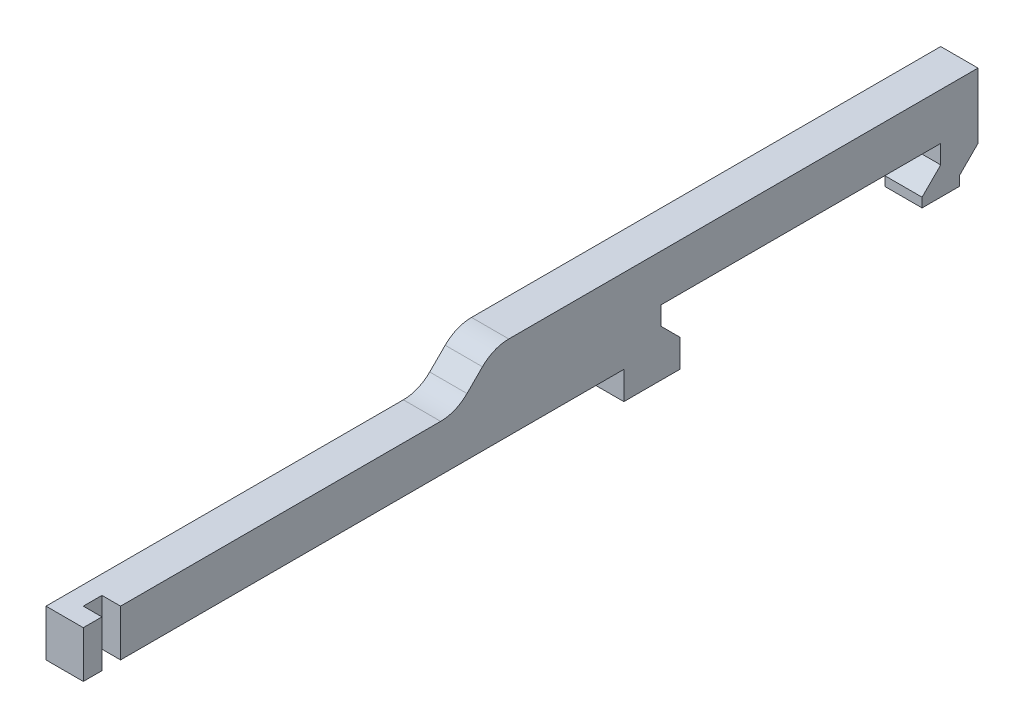
ISO-10303-21;
HEADER;
FILE_DESCRIPTION(('STEP AP214'),'2;1');
FILE_NAME('part.step','',(''),(''),'','','');
FILE_SCHEMA(('AUTOMOTIVE_DESIGN { 1 0 10303 214 1 1 1 1 }'));
ENDSEC;
DATA;
#1=APPLICATION_CONTEXT('core data for automotive mechanical design processes');
#2=APPLICATION_PROTOCOL_DEFINITION('international standard','automotive_design',2000,#1);
#3=PRODUCT_CONTEXT('',#1,'mechanical');
#4=PRODUCT('Part','Part','',(#3));
#5=PRODUCT_RELATED_PRODUCT_CATEGORY('part','',(#4));
#6=PRODUCT_DEFINITION_FORMATION('','',#4);
#7=PRODUCT_DEFINITION_CONTEXT('part definition',#1,'design');
#8=PRODUCT_DEFINITION('design','',#6,#7);
#9=PRODUCT_DEFINITION_SHAPE('','',#8);
#10=(LENGTH_UNIT() NAMED_UNIT(*) SI_UNIT(.MILLI.,.METRE.));
#11=(NAMED_UNIT(*) PLANE_ANGLE_UNIT() SI_UNIT($,.RADIAN.));
#12=(NAMED_UNIT(*) SI_UNIT($,.STERADIAN.) SOLID_ANGLE_UNIT());
#13=UNCERTAINTY_MEASURE_WITH_UNIT(LENGTH_MEASURE(1.E-05),#10,'distance_accuracy_value','');
#14=(GEOMETRIC_REPRESENTATION_CONTEXT(3) GLOBAL_UNCERTAINTY_ASSIGNED_CONTEXT((#13)) GLOBAL_UNIT_ASSIGNED_CONTEXT((#10,
#11,#12)) REPRESENTATION_CONTEXT('',''));
#15=CARTESIAN_POINT('',(0.,0.,0.));
#16=DIRECTION('',(0.,0.,1.));
#17=DIRECTION('',(1.,0.,0.));
#18=AXIS2_PLACEMENT_3D('',#15,#16,#17);
#19=CARTESIAN_POINT('',(2.,0.,0.));
#20=DIRECTION('',(1.,0.,0.));
#21=DIRECTION('',(0.,0.,-1.));
#22=AXIS2_PLACEMENT_3D('',#19,#20,#21);
#23=PLANE('',#22);
#24=DIRECTION('',(0.,-1.,0.));
#25=VECTOR('',#24,1.);
#26=CARTESIAN_POINT('',(2.,0.,-1.));
#27=LINE('',#26,#25);
#28=CARTESIAN_POINT('',(2.,2.5,-1.));
#29=VERTEX_POINT('',#28);
#30=CARTESIAN_POINT('',(2.,0.,-1.));
#31=VERTEX_POINT('',#30);
#32=EDGE_CURVE('E45',#29,#31,#27,.T.);
#33=ORIENTED_EDGE('',*,*,#32,.F.);
#34=DIRECTION('',(0.,0.,-1.));
#35=VECTOR('',#34,1.);
#36=CARTESIAN_POINT('',(2.,2.5,0.));
#37=LINE('',#36,#35);
#38=CARTESIAN_POINT('',(2.,2.5,0.));
#39=VERTEX_POINT('',#38);
#40=EDGE_CURVE('E216',#39,#29,#37,.T.);
#41=ORIENTED_EDGE('',*,*,#40,.F.);
#42=DIRECTION('',(0.,1.,0.));
#43=VECTOR('',#42,1.);
#44=CARTESIAN_POINT('',(2.,0.,0.));
#45=LINE('',#44,#43);
#46=CARTESIAN_POINT('',(2.,0.,0.));
#47=VERTEX_POINT('',#46);
#48=EDGE_CURVE('E220',#47,#39,#45,.T.);
#49=ORIENTED_EDGE('',*,*,#48,.F.);
#50=DIRECTION('',(0.,0.,-1.));
#51=VECTOR('',#50,1.);
#52=CARTESIAN_POINT('',(2.,0.,0.));
#53=LINE('',#52,#51);
#54=EDGE_CURVE('E229',#47,#31,#53,.T.);
#55=ORIENTED_EDGE('',*,*,#54,.T.);
#56=EDGE_LOOP('',(#33,#41,#49,#55));
#57=FACE_BOUND('',#56,.T.);
#58=ADVANCED_FACE('F37',(#57),#23,.T.);
#59=CARTESIAN_POINT('',(2.,0.,-48.));
#60=DIRECTION('',(0.,0.,1.));
#61=DIRECTION('',(1.,0.,0.));
#62=AXIS2_PLACEMENT_3D('',#59,#60,#61);
#63=PLANE('',#62);
#64=DIRECTION('',(0.,1.,0.));
#65=VECTOR('',#64,1.);
#66=CARTESIAN_POINT('',(0.,0.,-48.));
#67=LINE('',#66,#65);
#68=CARTESIAN_POINT('',(0.,1.,-48.));
#69=VERTEX_POINT('',#68);
#70=CARTESIAN_POINT('',(0.,4.5,-48.));
#71=VERTEX_POINT('',#70);
#72=EDGE_CURVE('E259',#69,#71,#67,.T.);
#73=ORIENTED_EDGE('',*,*,#72,.T.);
#74=DIRECTION('',(-1.,0.,0.));
#75=VECTOR('',#74,1.);
#76=CARTESIAN_POINT('',(2.,4.5,-48.));
#77=LINE('',#76,#75);
#78=CARTESIAN_POINT('',(2.,4.5,-48.));
#79=VERTEX_POINT('',#78);
#80=EDGE_CURVE('E344',#79,#71,#77,.T.);
#81=ORIENTED_EDGE('',*,*,#80,.F.);
#82=DIRECTION('',(0.,1.,0.));
#83=VECTOR('',#82,1.);
#84=CARTESIAN_POINT('',(2.,0.,-48.));
#85=LINE('',#84,#83);
#86=CARTESIAN_POINT('',(2.,1.,-48.));
#87=VERTEX_POINT('',#86);
#88=EDGE_CURVE('E304',#87,#79,#85,.T.);
#89=ORIENTED_EDGE('',*,*,#88,.F.);
#90=DIRECTION('',(-1.,0.,0.));
#91=VECTOR('',#90,1.);
#92=CARTESIAN_POINT('',(2.,1.,-48.));
#93=LINE('',#92,#91);
#94=EDGE_CURVE('E258',#87,#69,#93,.T.);
#95=ORIENTED_EDGE('',*,*,#94,.T.);
#96=EDGE_LOOP('',(#73,#81,#89,#95));
#97=FACE_BOUND('',#96,.T.);
#98=ADVANCED_FACE('F431',(#97),#63,.F.);
#99=CARTESIAN_POINT('',(2.,4.49999999999999,0.));
#100=DIRECTION('',(0.,-1.,0.));
#101=DIRECTION('',(0.,0.,-1.));
#102=AXIS2_PLACEMENT_3D('',#99,#100,#101);
#103=PLANE('',#102);
#104=DIRECTION('',(0.,0.,1.));
#105=VECTOR('',#104,1.);
#106=CARTESIAN_POINT('',(0.,4.49999999999999,0.));
#107=LINE('',#106,#105);
#108=CARTESIAN_POINT('',(0.,4.5,-22.8284271247462));
#109=VERTEX_POINT('',#108);
#110=EDGE_CURVE('E262',#71,#109,#107,.T.);
#111=ORIENTED_EDGE('',*,*,#110,.T.);
#112=DIRECTION('',(-1.,0.,0.));
#113=VECTOR('',#112,1.);
#114=CARTESIAN_POINT('',(2.,4.5,-22.8284271247462));
#115=LINE('',#114,#113);
#116=CARTESIAN_POINT('',(2.,4.5,-22.8284271247462));
#117=VERTEX_POINT('',#116);
#118=EDGE_CURVE('E354',#109,#117,#115,.F.);
#119=ORIENTED_EDGE('',*,*,#118,.T.);
#120=DIRECTION('',(0.,0.,1.));
#121=VECTOR('',#120,1.);
#122=CARTESIAN_POINT('',(2.,4.49999999999999,0.));
#123=LINE('',#122,#121);
#124=EDGE_CURVE('E222',#79,#117,#123,.T.);
#125=ORIENTED_EDGE('',*,*,#124,.F.);
#126=ORIENTED_EDGE('',*,*,#80,.T.);
#127=EDGE_LOOP('',(#111,#119,#125,#126));
#128=FACE_BOUND('',#127,.T.);
#129=ADVANCED_FACE('F438',(#128),#103,.F.);
#130=CARTESIAN_POINT('',(2.,-8.75,-8.75000000000001));
#131=DIRECTION('',(0.,0.707106781186547,0.707106781186548));
#132=DIRECTION('',(0.,-0.707106781186548,0.707106781186547));
#133=AXIS2_PLACEMENT_3D('',#130,#131,#132);
#134=PLANE('',#133);
#135=DIRECTION('',(0.,0.707106781186548,-0.707106781186547));
#136=VECTOR('',#135,1.);
#137=CARTESIAN_POINT('',(2.,-8.75,-8.75000000000001));
#138=LINE('',#137,#136);
#139=CARTESIAN_POINT('',(2.,3.08578643762691,-20.5857864376269));
#140=VERTEX_POINT('',#139);
#141=CARTESIAN_POINT('',(2.,3.91421356237309,-21.4142135623731));
#142=VERTEX_POINT('',#141);
#143=EDGE_CURVE('E217',#140,#142,#138,.T.);
#144=ORIENTED_EDGE('',*,*,#143,.T.);
#145=DIRECTION('',(-1.,0.,0.));
#146=VECTOR('',#145,1.);
#147=CARTESIAN_POINT('',(0.,3.91421356237309,-21.4142135623731));
#148=LINE('',#147,#146);
#149=CARTESIAN_POINT('',(0.,3.91421356237309,-21.4142135623731));
#150=VERTEX_POINT('',#149);
#151=EDGE_CURVE('E349',#142,#150,#148,.T.);
#152=ORIENTED_EDGE('',*,*,#151,.T.);
#153=DIRECTION('',(0.,0.707106781186548,-0.707106781186547));
#154=VECTOR('',#153,1.);
#155=CARTESIAN_POINT('',(0.,-8.75,-8.75000000000001));
#156=LINE('',#155,#154);
#157=CARTESIAN_POINT('',(0.,3.08578643762691,-20.5857864376269));
#158=VERTEX_POINT('',#157);
#159=EDGE_CURVE('E266',#158,#150,#156,.T.);
#160=ORIENTED_EDGE('',*,*,#159,.F.);
#161=DIRECTION('',(-1.,0.,0.));
#162=VECTOR('',#161,1.);
#163=CARTESIAN_POINT('',(2.,3.08578643762691,-20.5857864376269));
#164=LINE('',#163,#162);
#165=EDGE_CURVE('E347',#158,#140,#164,.F.);
#166=ORIENTED_EDGE('',*,*,#165,.T.);
#167=EDGE_LOOP('',(#144,#152,#160,#166));
#168=FACE_BOUND('',#167,.T.);
#169=ADVANCED_FACE('F414',(#168),#134,.T.);
#170=CARTESIAN_POINT('',(2.,2.5,0.));
#171=DIRECTION('',(0.,1.,0.));
#172=DIRECTION('',(0.,0.,1.));
#173=AXIS2_PLACEMENT_3D('',#170,#171,#172);
#174=PLANE('',#173);
#175=DIRECTION('',(1.,0.,0.));
#176=VECTOR('',#175,1.);
#177=CARTESIAN_POINT('',(2.,2.5,-1.));
#178=LINE('',#177,#176);
#179=CARTESIAN_POINT('',(1.,2.5,-1.));
#180=VERTEX_POINT('',#179);
#181=EDGE_CURVE('E367',#180,#29,#178,.T.);
#182=ORIENTED_EDGE('',*,*,#181,.F.);
#183=DIRECTION('',(0.,0.,1.));
#184=VECTOR('',#183,1.);
#185=CARTESIAN_POINT('',(1.,2.5,-1.));
#186=LINE('',#185,#184);
#187=CARTESIAN_POINT('',(1.,2.5,-2.));
#188=VERTEX_POINT('',#187);
#189=EDGE_CURVE('E210',#188,#180,#186,.T.);
#190=ORIENTED_EDGE('',*,*,#189,.F.);
#191=DIRECTION('',(-1.,0.,0.));
#192=VECTOR('',#191,1.);
#193=CARTESIAN_POINT('',(2.,2.5,-2.));
#194=LINE('',#193,#192);
#195=CARTESIAN_POINT('',(2.,2.5,-2.));
#196=VERTEX_POINT('',#195);
#197=EDGE_CURVE('E201',#196,#188,#194,.T.);
#198=ORIENTED_EDGE('',*,*,#197,.F.);
#199=CARTESIAN_POINT('',(2.,2.5,-19.1715728752538));
#200=VERTEX_POINT('',#199);
#201=EDGE_CURVE('E60',#196,#200,#37,.T.);
#202=ORIENTED_EDGE('',*,*,#201,.T.);
#203=DIRECTION('',(-1.,0.,0.));
#204=VECTOR('',#203,1.);
#205=CARTESIAN_POINT('',(0.,2.5,-19.1715728752538));
#206=LINE('',#205,#204);
#207=CARTESIAN_POINT('',(0.,2.5,-19.1715728752538));
#208=VERTEX_POINT('',#207);
#209=EDGE_CURVE('E358',#200,#208,#206,.T.);
#210=ORIENTED_EDGE('',*,*,#209,.T.);
#211=DIRECTION('',(0.,0.,-1.));
#212=VECTOR('',#211,1.);
#213=CARTESIAN_POINT('',(0.,2.5,0.));
#214=LINE('',#213,#212);
#215=CARTESIAN_POINT('',(0.,2.5,0.));
#216=VERTEX_POINT('',#215);
#217=EDGE_CURVE('E269',#216,#208,#214,.T.);
#218=ORIENTED_EDGE('',*,*,#217,.F.);
#219=DIRECTION('',(-1.,0.,0.));
#220=VECTOR('',#219,1.);
#221=CARTESIAN_POINT('',(2.,2.5,0.));
#222=LINE('',#221,#220);
#223=EDGE_CURVE('E342',#39,#216,#222,.T.);
#224=ORIENTED_EDGE('',*,*,#223,.F.);
#225=ORIENTED_EDGE('',*,*,#40,.T.);
#226=EDGE_LOOP('',(#182,#190,#198,#202,#210,#218,#224,#225));
#227=FACE_BOUND('',#226,.T.);
#228=ADVANCED_FACE('F208',(#227),#174,.T.);
#229=CARTESIAN_POINT('',(2.,0.,0.));
#230=DIRECTION('',(0.,0.,1.));
#231=DIRECTION('',(1.,0.,0.));
#232=AXIS2_PLACEMENT_3D('',#229,#230,#231);
#233=PLANE('',#232);
#234=DIRECTION('',(0.,1.,0.));
#235=VECTOR('',#234,1.);
#236=CARTESIAN_POINT('',(0.,0.,0.));
#237=LINE('',#236,#235);
#238=CARTESIAN_POINT('',(0.,0.,0.));
#239=VERTEX_POINT('',#238);
#240=EDGE_CURVE('E272',#239,#216,#237,.T.);
#241=ORIENTED_EDGE('',*,*,#240,.F.);
#242=DIRECTION('',(-1.,0.,0.));
#243=VECTOR('',#242,1.);
#244=CARTESIAN_POINT('',(2.,0.,0.));
#245=LINE('',#244,#243);
#246=EDGE_CURVE('E340',#47,#239,#245,.T.);
#247=ORIENTED_EDGE('',*,*,#246,.F.);
#248=ORIENTED_EDGE('',*,*,#48,.T.);
#249=ORIENTED_EDGE('',*,*,#223,.T.);
#250=EDGE_LOOP('',(#241,#247,#248,#249));
#251=FACE_BOUND('',#250,.T.);
#252=ADVANCED_FACE('F377',(#251),#233,.T.);
#253=CARTESIAN_POINT('',(2.,0.,0.));
#254=DIRECTION('',(0.,1.,0.));
#255=DIRECTION('',(0.,0.,1.));
#256=AXIS2_PLACEMENT_3D('',#253,#254,#255);
#257=PLANE('',#256);
#258=DIRECTION('',(0.,0.,1.));
#259=VECTOR('',#258,1.);
#260=CARTESIAN_POINT('',(1.,0.,0.));
#261=LINE('',#260,#259);
#262=CARTESIAN_POINT('',(1.,0.,-2.));
#263=VERTEX_POINT('',#262);
#264=CARTESIAN_POINT('',(1.,0.,-1.));
#265=VERTEX_POINT('',#264);
#266=EDGE_CURVE('E11',#263,#265,#261,.T.);
#267=ORIENTED_EDGE('',*,*,#266,.T.);
#268=DIRECTION('',(1.,0.,0.));
#269=VECTOR('',#268,1.);
#270=CARTESIAN_POINT('',(2.,0.,-1.));
#271=LINE('',#270,#269);
#272=EDGE_CURVE('E263',#265,#31,#271,.T.);
#273=ORIENTED_EDGE('',*,*,#272,.T.);
#274=ORIENTED_EDGE('',*,*,#54,.F.);
#275=ORIENTED_EDGE('',*,*,#246,.T.);
#276=DIRECTION('',(0.,0.,-1.));
#277=VECTOR('',#276,1.);
#278=CARTESIAN_POINT('',(0.,0.,0.));
#279=LINE('',#278,#277);
#280=CARTESIAN_POINT('',(0.,0.,-29.));
#281=VERTEX_POINT('',#280);
#282=EDGE_CURVE('E275',#239,#281,#279,.T.);
#283=ORIENTED_EDGE('',*,*,#282,.T.);
#284=DIRECTION('',(-1.,0.,0.));
#285=VECTOR('',#284,1.);
#286=CARTESIAN_POINT('',(2.,0.,-29.));
#287=LINE('',#286,#285);
#288=CARTESIAN_POINT('',(2.,0.,-29.));
#289=VERTEX_POINT('',#288);
#290=EDGE_CURVE('E337',#289,#281,#287,.T.);
#291=ORIENTED_EDGE('',*,*,#290,.F.);
#292=CARTESIAN_POINT('',(2.,0.,-2.));
#293=VERTEX_POINT('',#292);
#294=EDGE_CURVE('E228',#293,#289,#53,.T.);
#295=ORIENTED_EDGE('',*,*,#294,.F.);
#296=DIRECTION('',(-1.,0.,0.));
#297=VECTOR('',#296,1.);
#298=CARTESIAN_POINT('',(2.,0.,-2.));
#299=LINE('',#298,#297);
#300=EDGE_CURVE('E52',#293,#263,#299,.T.);
#301=ORIENTED_EDGE('',*,*,#300,.T.);
#302=EDGE_LOOP('',(#267,#273,#274,#275,#283,#291,#295,#301));
#303=FACE_BOUND('',#302,.T.);
#304=ADVANCED_FACE('F372',(#303),#257,.F.);
#305=CARTESIAN_POINT('',(2.,0.,-29.));
#306=DIRECTION('',(0.,0.,-1.));
#307=DIRECTION('',(-1.,0.,0.));
#308=AXIS2_PLACEMENT_3D('',#305,#306,#307);
#309=PLANE('',#308);
#310=DIRECTION('',(0.,-1.,0.));
#311=VECTOR('',#310,1.);
#312=CARTESIAN_POINT('',(0.,0.,-29.));
#313=LINE('',#312,#311);
#314=CARTESIAN_POINT('',(0.,-1.5,-29.));
#315=VERTEX_POINT('',#314);
#316=EDGE_CURVE('E277',#281,#315,#313,.T.);
#317=ORIENTED_EDGE('',*,*,#316,.T.);
#318=DIRECTION('',(-1.,0.,0.));
#319=VECTOR('',#318,1.);
#320=CARTESIAN_POINT('',(2.,-1.5,-29.));
#321=LINE('',#320,#319);
#322=CARTESIAN_POINT('',(2.,-1.5,-29.));
#323=VERTEX_POINT('',#322);
#324=EDGE_CURVE('E334',#323,#315,#321,.T.);
#325=ORIENTED_EDGE('',*,*,#324,.F.);
#326=DIRECTION('',(0.,-1.,0.));
#327=VECTOR('',#326,1.);
#328=CARTESIAN_POINT('',(2.,0.,-29.));
#329=LINE('',#328,#327);
#330=EDGE_CURVE('E232',#289,#323,#329,.T.);
#331=ORIENTED_EDGE('',*,*,#330,.F.);
#332=ORIENTED_EDGE('',*,*,#290,.T.);
#333=EDGE_LOOP('',(#317,#325,#331,#332));
#334=FACE_BOUND('',#333,.T.);
#335=ADVANCED_FACE('F388',(#334),#309,.F.);
#336=CARTESIAN_POINT('',(2.,-1.5,0.));
#337=DIRECTION('',(0.,1.,0.));
#338=DIRECTION('',(0.,0.,1.));
#339=AXIS2_PLACEMENT_3D('',#336,#337,#338);
#340=PLANE('',#339);
#341=DIRECTION('',(0.,0.,-1.));
#342=VECTOR('',#341,1.);
#343=CARTESIAN_POINT('',(0.,-1.5,0.));
#344=LINE('',#343,#342);
#345=CARTESIAN_POINT('',(0.,-1.5,-32.));
#346=VERTEX_POINT('',#345);
#347=EDGE_CURVE('E279',#315,#346,#344,.T.);
#348=ORIENTED_EDGE('',*,*,#347,.T.);
#349=DIRECTION('',(-1.,0.,0.));
#350=VECTOR('',#349,1.);
#351=CARTESIAN_POINT('',(2.,-1.5,-32.));
#352=LINE('',#351,#350);
#353=CARTESIAN_POINT('',(2.,-1.5,-32.));
#354=VERTEX_POINT('',#353);
#355=EDGE_CURVE('E331',#354,#346,#352,.T.);
#356=ORIENTED_EDGE('',*,*,#355,.F.);
#357=DIRECTION('',(0.,0.,-1.));
#358=VECTOR('',#357,1.);
#359=CARTESIAN_POINT('',(2.,-1.5,0.));
#360=LINE('',#359,#358);
#361=EDGE_CURVE('E234',#323,#354,#360,.T.);
#362=ORIENTED_EDGE('',*,*,#361,.F.);
#363=ORIENTED_EDGE('',*,*,#324,.T.);
#364=EDGE_LOOP('',(#348,#356,#362,#363));
#365=FACE_BOUND('',#364,.T.);
#366=ADVANCED_FACE('F392',(#365),#340,.F.);
#367=CARTESIAN_POINT('',(2.,0.,-32.));
#368=DIRECTION('',(0.,0.,1.));
#369=DIRECTION('',(1.,0.,0.));
#370=AXIS2_PLACEMENT_3D('',#367,#368,#369);
#371=PLANE('',#370);
#372=DIRECTION('',(0.,1.,0.));
#373=VECTOR('',#372,1.);
#374=CARTESIAN_POINT('',(0.,0.,-32.));
#375=LINE('',#374,#373);
#376=CARTESIAN_POINT('',(0.,0.,-32.));
#377=VERTEX_POINT('',#376);
#378=EDGE_CURVE('E281',#346,#377,#375,.T.);
#379=ORIENTED_EDGE('',*,*,#378,.T.);
#380=DIRECTION('',(-1.,0.,0.));
#381=VECTOR('',#380,1.);
#382=CARTESIAN_POINT('',(2.,0.,-32.));
#383=LINE('',#382,#381);
#384=CARTESIAN_POINT('',(2.,0.,-32.));
#385=VERTEX_POINT('',#384);
#386=EDGE_CURVE('E328',#385,#377,#383,.T.);
#387=ORIENTED_EDGE('',*,*,#386,.F.);
#388=DIRECTION('',(0.,1.,0.));
#389=VECTOR('',#388,1.);
#390=CARTESIAN_POINT('',(2.,0.,-32.));
#391=LINE('',#390,#389);
#392=EDGE_CURVE('E236',#354,#385,#391,.T.);
#393=ORIENTED_EDGE('',*,*,#392,.F.);
#394=ORIENTED_EDGE('',*,*,#355,.T.);
#395=EDGE_LOOP('',(#379,#387,#393,#394));
#396=FACE_BOUND('',#395,.T.);
#397=ADVANCED_FACE('F485',(#396),#371,.F.);
#398=CARTESIAN_POINT('',(2.,16.,-16.));
#399=DIRECTION('',(0.,-0.707106781186547,0.707106781186547));
#400=DIRECTION('',(0.,-0.707106781186548,-0.707106781186548));
#401=AXIS2_PLACEMENT_3D('',#398,#399,#400);
#402=PLANE('',#401);
#403=DIRECTION('',(0.,0.707106781186548,0.707106781186548));
#404=VECTOR('',#403,1.);
#405=CARTESIAN_POINT('',(0.,16.,-16.));
#406=LINE('',#405,#404);
#407=CARTESIAN_POINT('',(0.,1.,-31.));
#408=VERTEX_POINT('',#407);
#409=EDGE_CURVE('E283',#377,#408,#406,.T.);
#410=ORIENTED_EDGE('',*,*,#409,.T.);
#411=DIRECTION('',(-1.,0.,0.));
#412=VECTOR('',#411,1.);
#413=CARTESIAN_POINT('',(2.,1.,-31.));
#414=LINE('',#413,#412);
#415=CARTESIAN_POINT('',(2.,1.,-31.));
#416=VERTEX_POINT('',#415);
#417=EDGE_CURVE('E325',#416,#408,#414,.T.);
#418=ORIENTED_EDGE('',*,*,#417,.F.);
#419=DIRECTION('',(0.,0.707106781186548,0.707106781186548));
#420=VECTOR('',#419,1.);
#421=CARTESIAN_POINT('',(2.,16.,-16.));
#422=LINE('',#421,#420);
#423=EDGE_CURVE('E238',#385,#416,#422,.T.);
#424=ORIENTED_EDGE('',*,*,#423,.F.);
#425=ORIENTED_EDGE('',*,*,#386,.T.);
#426=EDGE_LOOP('',(#410,#418,#424,#425));
#427=FACE_BOUND('',#426,.T.);
#428=ADVANCED_FACE('F481',(#427),#402,.F.);
#429=CARTESIAN_POINT('',(2.,0.,-31.));
#430=DIRECTION('',(0.,0.,1.));
#431=DIRECTION('',(1.,0.,0.));
#432=AXIS2_PLACEMENT_3D('',#429,#430,#431);
#433=PLANE('',#432);
#434=DIRECTION('',(0.,1.,0.));
#435=VECTOR('',#434,1.);
#436=CARTESIAN_POINT('',(0.,0.,-31.));
#437=LINE('',#436,#435);
#438=CARTESIAN_POINT('',(0.,2.,-31.));
#439=VERTEX_POINT('',#438);
#440=EDGE_CURVE('E285',#408,#439,#437,.T.);
#441=ORIENTED_EDGE('',*,*,#440,.T.);
#442=DIRECTION('',(-1.,0.,0.));
#443=VECTOR('',#442,1.);
#444=CARTESIAN_POINT('',(2.,2.,-31.));
#445=LINE('',#444,#443);
#446=CARTESIAN_POINT('',(2.,2.,-31.));
#447=VERTEX_POINT('',#446);
#448=EDGE_CURVE('E322',#447,#439,#445,.T.);
#449=ORIENTED_EDGE('',*,*,#448,.F.);
#450=DIRECTION('',(0.,1.,0.));
#451=VECTOR('',#450,1.);
#452=CARTESIAN_POINT('',(2.,0.,-31.));
#453=LINE('',#452,#451);
#454=EDGE_CURVE('E240',#416,#447,#453,.T.);
#455=ORIENTED_EDGE('',*,*,#454,.F.);
#456=ORIENTED_EDGE('',*,*,#417,.T.);
#457=EDGE_LOOP('',(#441,#449,#455,#456));
#458=FACE_BOUND('',#457,.T.);
#459=ADVANCED_FACE('F477',(#458),#433,.F.);
#460=CARTESIAN_POINT('',(2.,2.,0.));
#461=DIRECTION('',(0.,1.,0.));
#462=DIRECTION('',(0.,0.,1.));
#463=AXIS2_PLACEMENT_3D('',#460,#461,#462);
#464=PLANE('',#463);
#465=DIRECTION('',(0.,0.,-1.));
#466=VECTOR('',#465,1.);
#467=CARTESIAN_POINT('',(0.,2.,0.));
#468=LINE('',#467,#466);
#469=CARTESIAN_POINT('',(0.,2.,-46.));
#470=VERTEX_POINT('',#469);
#471=EDGE_CURVE('E287',#439,#470,#468,.T.);
#472=ORIENTED_EDGE('',*,*,#471,.T.);
#473=DIRECTION('',(-1.,0.,0.));
#474=VECTOR('',#473,1.);
#475=CARTESIAN_POINT('',(2.,2.,-46.));
#476=LINE('',#475,#474);
#477=CARTESIAN_POINT('',(2.,2.,-46.));
#478=VERTEX_POINT('',#477);
#479=EDGE_CURVE('E320',#478,#470,#476,.T.);
#480=ORIENTED_EDGE('',*,*,#479,.F.);
#481=DIRECTION('',(0.,0.,-1.));
#482=VECTOR('',#481,1.);
#483=CARTESIAN_POINT('',(2.,2.,0.));
#484=LINE('',#483,#482);
#485=EDGE_CURVE('E242',#447,#478,#484,.T.);
#486=ORIENTED_EDGE('',*,*,#485,.F.);
#487=ORIENTED_EDGE('',*,*,#448,.T.);
#488=EDGE_LOOP('',(#472,#480,#486,#487));
#489=FACE_BOUND('',#488,.T.);
#490=ADVANCED_FACE('F473',(#489),#464,.F.);
#491=CARTESIAN_POINT('',(2.,0.,-46.));
#492=DIRECTION('',(0.,0.,1.));
#493=DIRECTION('',(1.,0.,0.));
#494=AXIS2_PLACEMENT_3D('',#491,#492,#493);
#495=PLANE('',#494);
#496=DIRECTION('',(0.,1.,0.));
#497=VECTOR('',#496,1.);
#498=CARTESIAN_POINT('',(0.,0.,-46.));
#499=LINE('',#498,#497);
#500=CARTESIAN_POINT('',(0.,1.,-46.));
#501=VERTEX_POINT('',#500);
#502=EDGE_CURVE('E290',#501,#470,#499,.T.);
#503=ORIENTED_EDGE('',*,*,#502,.F.);
#504=DIRECTION('',(-1.,0.,0.));
#505=VECTOR('',#504,1.);
#506=CARTESIAN_POINT('',(2.,1.,-46.));
#507=LINE('',#506,#505);
#508=CARTESIAN_POINT('',(2.,1.,-46.));
#509=VERTEX_POINT('',#508);
#510=EDGE_CURVE('E318',#509,#501,#507,.T.);
#511=ORIENTED_EDGE('',*,*,#510,.F.);
#512=DIRECTION('',(0.,1.,0.));
#513=VECTOR('',#512,1.);
#514=CARTESIAN_POINT('',(2.,0.,-46.));
#515=LINE('',#514,#513);
#516=EDGE_CURVE('E244',#509,#478,#515,.T.);
#517=ORIENTED_EDGE('',*,*,#516,.T.);
#518=ORIENTED_EDGE('',*,*,#479,.T.);
#519=EDGE_LOOP('',(#503,#511,#517,#518));
#520=FACE_BOUND('',#519,.T.);
#521=ADVANCED_FACE('F469',(#520),#495,.T.);
#522=CARTESIAN_POINT('',(2.,-22.5,-22.5));
#523=DIRECTION('',(0.,0.707106781186547,0.707106781186547));
#524=DIRECTION('',(0.,-0.707106781186548,0.707106781186548));
#525=AXIS2_PLACEMENT_3D('',#522,#523,#524);
#526=PLANE('',#525);
#527=DIRECTION('',(0.,0.707106781186548,-0.707106781186548));
#528=VECTOR('',#527,1.);
#529=CARTESIAN_POINT('',(0.,-22.5,-22.5));
#530=LINE('',#529,#528);
#531=CARTESIAN_POINT('',(0.,0.,-45.));
#532=VERTEX_POINT('',#531);
#533=EDGE_CURVE('E293',#532,#501,#530,.T.);
#534=ORIENTED_EDGE('',*,*,#533,.F.);
#535=DIRECTION('',(-1.,0.,0.));
#536=VECTOR('',#535,1.);
#537=CARTESIAN_POINT('',(2.,0.,-45.));
#538=LINE('',#537,#536);
#539=CARTESIAN_POINT('',(2.,0.,-45.));
#540=VERTEX_POINT('',#539);
#541=EDGE_CURVE('E316',#540,#532,#538,.T.);
#542=ORIENTED_EDGE('',*,*,#541,.F.);
#543=DIRECTION('',(0.,0.707106781186548,-0.707106781186548));
#544=VECTOR('',#543,1.);
#545=CARTESIAN_POINT('',(2.,-22.5,-22.5));
#546=LINE('',#545,#544);
#547=EDGE_CURVE('E247',#540,#509,#546,.T.);
#548=ORIENTED_EDGE('',*,*,#547,.T.);
#549=ORIENTED_EDGE('',*,*,#510,.T.);
#550=EDGE_LOOP('',(#534,#542,#548,#549));
#551=FACE_BOUND('',#550,.T.);
#552=ADVANCED_FACE('F465',(#551),#526,.T.);
#553=CARTESIAN_POINT('',(2.,0.,-45.));
#554=DIRECTION('',(0.,0.,-1.));
#555=DIRECTION('',(-1.,0.,0.));
#556=AXIS2_PLACEMENT_3D('',#553,#554,#555);
#557=PLANE('',#556);
#558=DIRECTION('',(0.,-1.,0.));
#559=VECTOR('',#558,1.);
#560=CARTESIAN_POINT('',(0.,0.,-45.));
#561=LINE('',#560,#559);
#562=CARTESIAN_POINT('',(0.,-0.499999999999998,-45.));
#563=VERTEX_POINT('',#562);
#564=EDGE_CURVE('E296',#532,#563,#561,.T.);
#565=ORIENTED_EDGE('',*,*,#564,.T.);
#566=DIRECTION('',(-1.,0.,0.));
#567=VECTOR('',#566,1.);
#568=CARTESIAN_POINT('',(2.,-0.499999999999998,-45.));
#569=LINE('',#568,#567);
#570=CARTESIAN_POINT('',(2.,-0.499999999999998,-45.));
#571=VERTEX_POINT('',#570);
#572=EDGE_CURVE('E313',#571,#563,#569,.T.);
#573=ORIENTED_EDGE('',*,*,#572,.F.);
#574=DIRECTION('',(0.,-1.,0.));
#575=VECTOR('',#574,1.);
#576=CARTESIAN_POINT('',(2.,0.,-45.));
#577=LINE('',#576,#575);
#578=EDGE_CURVE('E250',#540,#571,#577,.T.);
#579=ORIENTED_EDGE('',*,*,#578,.F.);
#580=ORIENTED_EDGE('',*,*,#541,.T.);
#581=EDGE_LOOP('',(#565,#573,#579,#580));
#582=FACE_BOUND('',#581,.T.);
#583=ADVANCED_FACE('F461',(#582),#557,.F.);
#584=CARTESIAN_POINT('',(2.,-0.499999999999998,0.));
#585=DIRECTION('',(0.,1.,0.));
#586=DIRECTION('',(0.,0.,1.));
#587=AXIS2_PLACEMENT_3D('',#584,#585,#586);
#588=PLANE('',#587);
#589=DIRECTION('',(0.,0.,-1.));
#590=VECTOR('',#589,1.);
#591=CARTESIAN_POINT('',(0.,-0.499999999999998,0.));
#592=LINE('',#591,#590);
#593=CARTESIAN_POINT('',(0.,-0.499999999999998,-47.));
#594=VERTEX_POINT('',#593);
#595=EDGE_CURVE('E298',#563,#594,#592,.T.);
#596=ORIENTED_EDGE('',*,*,#595,.T.);
#597=DIRECTION('',(-1.,0.,0.));
#598=VECTOR('',#597,1.);
#599=CARTESIAN_POINT('',(2.,-0.499999999999998,-47.));
#600=LINE('',#599,#598);
#601=CARTESIAN_POINT('',(2.,-0.499999999999998,-47.));
#602=VERTEX_POINT('',#601);
#603=EDGE_CURVE('E310',#602,#594,#600,.T.);
#604=ORIENTED_EDGE('',*,*,#603,.F.);
#605=DIRECTION('',(0.,0.,-1.));
#606=VECTOR('',#605,1.);
#607=CARTESIAN_POINT('',(2.,-0.499999999999998,0.));
#608=LINE('',#607,#606);
#609=EDGE_CURVE('E252',#571,#602,#608,.T.);
#610=ORIENTED_EDGE('',*,*,#609,.F.);
#611=ORIENTED_EDGE('',*,*,#572,.T.);
#612=EDGE_LOOP('',(#596,#604,#610,#611));
#613=FACE_BOUND('',#612,.T.);
#614=ADVANCED_FACE('F455',(#613),#588,.F.);
#615=CARTESIAN_POINT('',(2.,0.,-47.));
#616=DIRECTION('',(0.,0.,1.));
#617=DIRECTION('',(1.,0.,0.));
#618=AXIS2_PLACEMENT_3D('',#615,#616,#617);
#619=PLANE('',#618);
#620=DIRECTION('',(0.,1.,0.));
#621=VECTOR('',#620,1.);
#622=CARTESIAN_POINT('',(0.,0.,-47.));
#623=LINE('',#622,#621);
#624=CARTESIAN_POINT('',(0.,0.,-47.));
#625=VERTEX_POINT('',#624);
#626=EDGE_CURVE('E300',#594,#625,#623,.T.);
#627=ORIENTED_EDGE('',*,*,#626,.T.);
#628=DIRECTION('',(-1.,0.,0.));
#629=VECTOR('',#628,1.);
#630=CARTESIAN_POINT('',(2.,0.,-47.));
#631=LINE('',#630,#629);
#632=CARTESIAN_POINT('',(2.,0.,-47.));
#633=VERTEX_POINT('',#632);
#634=EDGE_CURVE('E307',#633,#625,#631,.T.);
#635=ORIENTED_EDGE('',*,*,#634,.F.);
#636=DIRECTION('',(0.,1.,0.));
#637=VECTOR('',#636,1.);
#638=CARTESIAN_POINT('',(2.,0.,-47.));
#639=LINE('',#638,#637);
#640=EDGE_CURVE('E254',#602,#633,#639,.T.);
#641=ORIENTED_EDGE('',*,*,#640,.F.);
#642=ORIENTED_EDGE('',*,*,#603,.T.);
#643=EDGE_LOOP('',(#627,#635,#641,#642));
#644=FACE_BOUND('',#643,.T.);
#645=ADVANCED_FACE('F449',(#644),#619,.F.);
#646=CARTESIAN_POINT('',(2.,-23.5,-23.5));
#647=DIRECTION('',(0.,0.707106781186547,0.707106781186548));
#648=DIRECTION('',(0.,-0.707106781186548,0.707106781186547));
#649=AXIS2_PLACEMENT_3D('',#646,#647,#648);
#650=PLANE('',#649);
#651=DIRECTION('',(0.,0.707106781186548,-0.707106781186547));
#652=VECTOR('',#651,1.);
#653=CARTESIAN_POINT('',(0.,-23.5,-23.5));
#654=LINE('',#653,#652);
#655=EDGE_CURVE('E302',#625,#69,#654,.T.);
#656=ORIENTED_EDGE('',*,*,#655,.T.);
#657=ORIENTED_EDGE('',*,*,#94,.F.);
#658=DIRECTION('',(0.,0.707106781186548,-0.707106781186547));
#659=VECTOR('',#658,1.);
#660=CARTESIAN_POINT('',(2.,-23.5,-23.5));
#661=LINE('',#660,#659);
#662=EDGE_CURVE('E256',#633,#87,#661,.T.);
#663=ORIENTED_EDGE('',*,*,#662,.F.);
#664=ORIENTED_EDGE('',*,*,#634,.T.);
#665=EDGE_LOOP('',(#656,#657,#663,#664));
#666=FACE_BOUND('',#665,.T.);
#667=ADVANCED_FACE('F443',(#666),#650,.F.);
#668=DIRECTION('',(0.,1.,0.));
#669=VECTOR('',#668,1.);
#670=CARTESIAN_POINT('',(2.,0.,-2.));
#671=LINE('',#670,#669);
#672=EDGE_CURVE('E199',#293,#196,#671,.T.);
#673=ORIENTED_EDGE('',*,*,#672,.F.);
#674=ORIENTED_EDGE('',*,*,#294,.T.);
#675=ORIENTED_EDGE('',*,*,#330,.T.);
#676=ORIENTED_EDGE('',*,*,#361,.T.);
#677=ORIENTED_EDGE('',*,*,#392,.T.);
#678=ORIENTED_EDGE('',*,*,#423,.T.);
#679=ORIENTED_EDGE('',*,*,#454,.T.);
#680=ORIENTED_EDGE('',*,*,#485,.T.);
#681=ORIENTED_EDGE('',*,*,#516,.F.);
#682=ORIENTED_EDGE('',*,*,#547,.F.);
#683=ORIENTED_EDGE('',*,*,#578,.T.);
#684=ORIENTED_EDGE('',*,*,#609,.T.);
#685=ORIENTED_EDGE('',*,*,#640,.T.);
#686=ORIENTED_EDGE('',*,*,#662,.T.);
#687=ORIENTED_EDGE('',*,*,#88,.T.);
#688=ORIENTED_EDGE('',*,*,#124,.T.);
#689=CARTESIAN_POINT('',(2.,2.5,-22.8284271247462));
#690=DIRECTION('',(1.,0.,0.));
#691=DIRECTION('',(0.,0.,-1.));
#692=AXIS2_PLACEMENT_3D('',#689,#690,#691);
#693=CIRCLE('',#692,2.);
#694=EDGE_CURVE('E356',#117,#142,#693,.T.);
#695=ORIENTED_EDGE('',*,*,#694,.T.);
#696=ORIENTED_EDGE('',*,*,#143,.F.);
#697=CARTESIAN_POINT('',(2.,4.5,-19.1715728752538));
#698=DIRECTION('',(1.,0.,0.));
#699=DIRECTION('',(0.,0.,-1.));
#700=AXIS2_PLACEMENT_3D('',#697,#698,#699);
#701=CIRCLE('',#700,2.);
#702=EDGE_CURVE('E205',#140,#200,#701,.F.);
#703=ORIENTED_EDGE('',*,*,#702,.T.);
#704=ORIENTED_EDGE('',*,*,#201,.F.);
#705=EDGE_LOOP('',(#673,#674,#675,#676,#677,#678,#679,#680,#681,#682,#683,#684,#685,#686,#687,
#688,#695,#696,#703,#704));
#706=FACE_BOUND('',#705,.T.);
#707=ADVANCED_FACE('F212',(#706),#23,.T.);
#708=CARTESIAN_POINT('',(0.,0.,0.));
#709=DIRECTION('',(1.,0.,0.));
#710=DIRECTION('',(0.,0.,-1.));
#711=AXIS2_PLACEMENT_3D('',#708,#709,#710);
#712=PLANE('',#711);
#713=ORIENTED_EDGE('',*,*,#159,.T.);
#714=CARTESIAN_POINT('',(0.,2.5,-22.8284271247462));
#715=DIRECTION('',(1.,0.,0.));
#716=DIRECTION('',(0.,0.,-1.));
#717=AXIS2_PLACEMENT_3D('',#714,#715,#716);
#718=CIRCLE('',#717,2.);
#719=EDGE_CURVE('E352',#150,#109,#718,.F.);
#720=ORIENTED_EDGE('',*,*,#719,.T.);
#721=ORIENTED_EDGE('',*,*,#110,.F.);
#722=ORIENTED_EDGE('',*,*,#72,.F.);
#723=ORIENTED_EDGE('',*,*,#655,.F.);
#724=ORIENTED_EDGE('',*,*,#626,.F.);
#725=ORIENTED_EDGE('',*,*,#595,.F.);
#726=ORIENTED_EDGE('',*,*,#564,.F.);
#727=ORIENTED_EDGE('',*,*,#533,.T.);
#728=ORIENTED_EDGE('',*,*,#502,.T.);
#729=ORIENTED_EDGE('',*,*,#471,.F.);
#730=ORIENTED_EDGE('',*,*,#440,.F.);
#731=ORIENTED_EDGE('',*,*,#409,.F.);
#732=ORIENTED_EDGE('',*,*,#378,.F.);
#733=ORIENTED_EDGE('',*,*,#347,.F.);
#734=ORIENTED_EDGE('',*,*,#316,.F.);
#735=ORIENTED_EDGE('',*,*,#282,.F.);
#736=ORIENTED_EDGE('',*,*,#240,.T.);
#737=ORIENTED_EDGE('',*,*,#217,.T.);
#738=CARTESIAN_POINT('',(0.,4.5,-19.1715728752538));
#739=DIRECTION('',(1.,0.,0.));
#740=DIRECTION('',(0.,0.,-1.));
#741=AXIS2_PLACEMENT_3D('',#738,#739,#740);
#742=CIRCLE('',#741,2.);
#743=EDGE_CURVE('E360',#208,#158,#742,.T.);
#744=ORIENTED_EDGE('',*,*,#743,.T.);
#745=EDGE_LOOP('',(#713,#720,#721,#722,#723,#724,#725,#726,#727,#728,#729,#730,#731,#732,#733,
#734,#735,#736,#737,#744));
#746=FACE_BOUND('',#745,.T.);
#747=ADVANCED_FACE('F383',(#746),#712,.F.);
#748=CARTESIAN_POINT('',(2.,2.5,-22.8284271247462));
#749=DIRECTION('',(1.,0.,0.));
#750=DIRECTION('',(0.,0.,-1.));
#751=AXIS2_PLACEMENT_3D('',#748,#749,#750);
#752=CYLINDRICAL_SURFACE('',#751,2.);
#753=ORIENTED_EDGE('',*,*,#694,.F.);
#754=ORIENTED_EDGE('',*,*,#118,.F.);
#755=ORIENTED_EDGE('',*,*,#719,.F.);
#756=ORIENTED_EDGE('',*,*,#151,.F.);
#757=EDGE_LOOP('',(#753,#754,#755,#756));
#758=FACE_BOUND('',#757,.T.);
#759=ADVANCED_FACE('F411',(#758),#752,.T.);
#760=CARTESIAN_POINT('',(2.,4.5,-19.1715728752538));
#761=DIRECTION('',(1.,0.,0.));
#762=DIRECTION('',(0.,0.,-1.));
#763=AXIS2_PLACEMENT_3D('',#760,#761,#762);
#764=CYLINDRICAL_SURFACE('',#763,2.);
#765=ORIENTED_EDGE('',*,*,#702,.F.);
#766=ORIENTED_EDGE('',*,*,#165,.F.);
#767=ORIENTED_EDGE('',*,*,#743,.F.);
#768=ORIENTED_EDGE('',*,*,#209,.F.);
#769=EDGE_LOOP('',(#765,#766,#767,#768));
#770=FACE_BOUND('',#769,.T.);
#771=ADVANCED_FACE('F39',(#770),#764,.F.);
#772=CARTESIAN_POINT('',(1.,-1.5,-1.));
#773=DIRECTION('',(-1.,0.,0.));
#774=DIRECTION('',(0.,0.,1.));
#775=AXIS2_PLACEMENT_3D('',#772,#773,#774);
#776=PLANE('',#775);
#777=DIRECTION('',(0.,1.,0.));
#778=VECTOR('',#777,1.);
#779=CARTESIAN_POINT('',(1.,-1.5,-2.));
#780=LINE('',#779,#778);
#781=EDGE_CURVE('E398',#263,#188,#780,.T.);
#782=ORIENTED_EDGE('',*,*,#781,.T.);
#783=ORIENTED_EDGE('',*,*,#189,.T.);
#784=DIRECTION('',(0.,1.,0.));
#785=VECTOR('',#784,1.);
#786=CARTESIAN_POINT('',(1.,-1.5,-1.));
#787=LINE('',#786,#785);
#788=EDGE_CURVE('E396',#265,#180,#787,.T.);
#789=ORIENTED_EDGE('',*,*,#788,.F.);
#790=ORIENTED_EDGE('',*,*,#266,.F.);
#791=EDGE_LOOP('',(#782,#783,#789,#790));
#792=FACE_BOUND('',#791,.T.);
#793=ADVANCED_FACE('F420',(#792),#776,.F.);
#794=CARTESIAN_POINT('',(2.,-1.5,-1.));
#795=DIRECTION('',(0.,0.,1.));
#796=DIRECTION('',(1.,0.,0.));
#797=AXIS2_PLACEMENT_3D('',#794,#795,#796);
#798=PLANE('',#797);
#799=ORIENTED_EDGE('',*,*,#788,.T.);
#800=ORIENTED_EDGE('',*,*,#181,.T.);
#801=ORIENTED_EDGE('',*,*,#32,.T.);
#802=ORIENTED_EDGE('',*,*,#272,.F.);
#803=EDGE_LOOP('',(#799,#800,#801,#802));
#804=FACE_BOUND('',#803,.T.);
#805=ADVANCED_FACE('F365',(#804),#798,.F.);
#806=CARTESIAN_POINT('',(2.,-1.5,-2.));
#807=DIRECTION('',(0.,0.,-1.));
#808=DIRECTION('',(0.,1.,0.));
#809=AXIS2_PLACEMENT_3D('',#806,#807,#808);
#810=PLANE('',#809);
#811=ORIENTED_EDGE('',*,*,#672,.T.);
#812=ORIENTED_EDGE('',*,*,#197,.T.);
#813=ORIENTED_EDGE('',*,*,#781,.F.);
#814=ORIENTED_EDGE('',*,*,#300,.F.);
#815=EDGE_LOOP('',(#811,#812,#813,#814));
#816=FACE_BOUND('',#815,.T.);
#817=ADVANCED_FACE('F200',(#816),#810,.F.);
#818=CLOSED_SHELL('',(#58,#98,#129,#169,#228,#252,#304,#335,#366,#397,#428,#459,#490,#521,#552,
#583,#614,#645,#667,#707,#747,#759,#771,#793,#805,#817));
#819=MANIFOLD_SOLID_BREP('B2',#818);
#820=ADVANCED_BREP_SHAPE_REPRESENTATION('',(#18,#819),#14);
#821=SHAPE_DEFINITION_REPRESENTATION(#9,#820);
ENDSEC;
END-ISO-10303-21;
